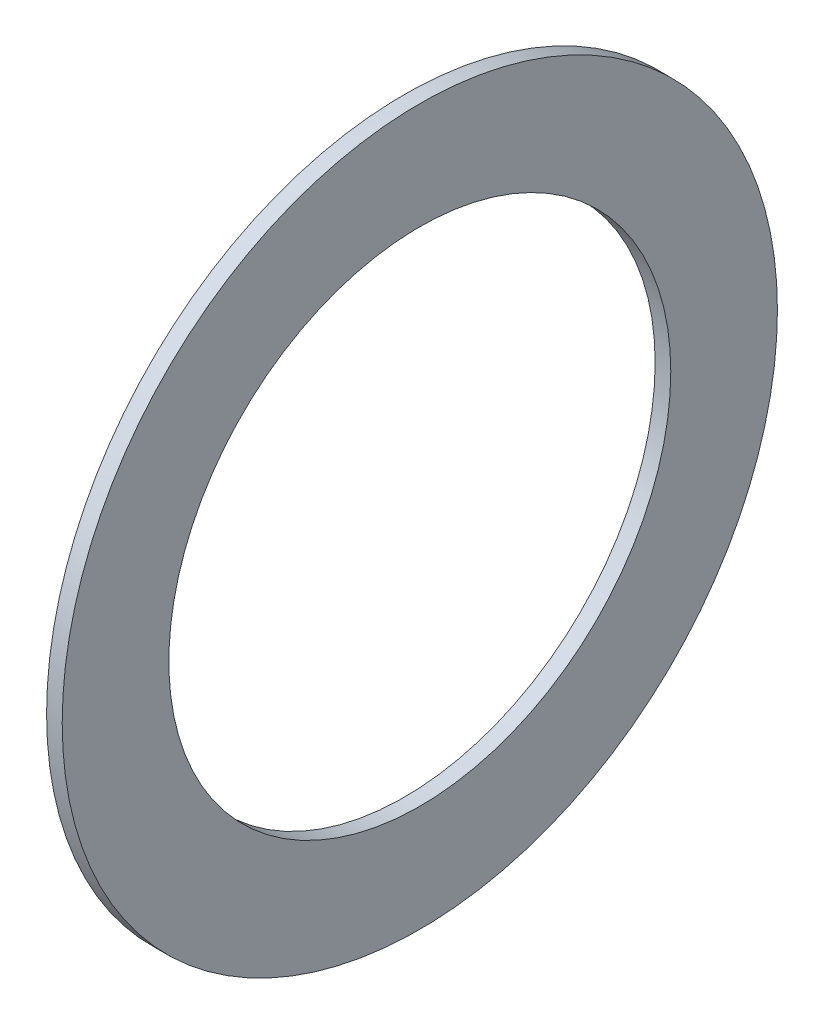
ISO-10303-21;
HEADER;
FILE_DESCRIPTION(('STEP AP214'),'2;1');
FILE_NAME('part.step','',(''),(''),'','','');
FILE_SCHEMA(('AUTOMOTIVE_DESIGN { 1 0 10303 214 1 1 1 1 }'));
ENDSEC;
DATA;
#1=APPLICATION_CONTEXT('core data for automotive mechanical design processes');
#2=APPLICATION_PROTOCOL_DEFINITION('international standard','automotive_design',2000,#1);
#3=PRODUCT_CONTEXT('',#1,'mechanical');
#4=PRODUCT('Part','Part','',(#3));
#5=PRODUCT_RELATED_PRODUCT_CATEGORY('part','',(#4));
#6=PRODUCT_DEFINITION_FORMATION('','',#4);
#7=PRODUCT_DEFINITION_CONTEXT('part definition',#1,'design');
#8=PRODUCT_DEFINITION('design','',#6,#7);
#9=PRODUCT_DEFINITION_SHAPE('','',#8);
#10=(LENGTH_UNIT() NAMED_UNIT(*) SI_UNIT(.MILLI.,.METRE.));
#11=(NAMED_UNIT(*) PLANE_ANGLE_UNIT() SI_UNIT($,.RADIAN.));
#12=(NAMED_UNIT(*) SI_UNIT($,.STERADIAN.) SOLID_ANGLE_UNIT());
#13=UNCERTAINTY_MEASURE_WITH_UNIT(LENGTH_MEASURE(1.E-05),#10,'distance_accuracy_value','');
#14=(GEOMETRIC_REPRESENTATION_CONTEXT(3) GLOBAL_UNCERTAINTY_ASSIGNED_CONTEXT((#13)) GLOBAL_UNIT_ASSIGNED_CONTEXT((#10,
#11,#12)) REPRESENTATION_CONTEXT('',''));
#15=CARTESIAN_POINT('',(0.,0.,0.));
#16=DIRECTION('',(0.,0.,1.));
#17=DIRECTION('',(1.,0.,0.));
#18=AXIS2_PLACEMENT_3D('',#15,#16,#17);
#19=CARTESIAN_POINT('',(-7.3144315497404,23.2577805330017,0.));
#20=DIRECTION('',(-1.,0.,0.));
#21=DIRECTION('',(0.,0.,1.));
#22=AXIS2_PLACEMENT_3D('',#19,#20,#21);
#23=PLANE('',#22);
#24=CARTESIAN_POINT('',(-7.31443154974033,0.,0.));
#25=DIRECTION('',(1.,0.,0.));
#26=DIRECTION('',(0.,0.,-1.));
#27=AXIS2_PLACEMENT_3D('',#24,#25,#26);
#28=CIRCLE('',#27,16.3222252770479);
#29=CARTESIAN_POINT('',(-7.31443154974033,0.,-16.3222252770479));
#30=VERTEX_POINT('',#29);
#31=EDGE_CURVE('E27',#30,#30,#28,.T.);
#32=ORIENTED_EDGE('',*,*,#31,.T.);
#33=EDGE_LOOP('',(#32));
#34=FACE_BOUND('',#33,.T.);
#35=CARTESIAN_POINT('',(-7.3144315497403,0.,0.));
#36=DIRECTION('',(1.,0.,0.));
#37=DIRECTION('',(0.,0.,-1.));
#38=AXIS2_PLACEMENT_3D('',#35,#36,#37);
#39=CIRCLE('',#38,23.2577805330017);
#40=CARTESIAN_POINT('',(-7.3144315497403,0.,-23.2577805330017));
#41=VERTEX_POINT('',#40);
#42=EDGE_CURVE('E18',#41,#41,#39,.T.);
#43=ORIENTED_EDGE('',*,*,#42,.F.);
#44=EDGE_LOOP('',(#43));
#45=FACE_BOUND('',#44,.T.);
#46=ADVANCED_FACE('F15',(#34,#45),#23,.T.);
#47=CARTESIAN_POINT('',(111.552923356394,0.,0.));
#48=DIRECTION('',(1.,0.,0.));
#49=DIRECTION('',(0.,0.,-1.));
#50=AXIS2_PLACEMENT_3D('',#47,#48,#49);
#51=CYLINDRICAL_SURFACE('',#50,23.2577805330017);
#52=CARTESIAN_POINT('',(-6.29843154974025,0.,0.));
#53=DIRECTION('',(1.,0.,0.));
#54=DIRECTION('',(0.,0.,-1.));
#55=AXIS2_PLACEMENT_3D('',#52,#53,#54);
#56=CIRCLE('',#55,23.2577805330017);
#57=CARTESIAN_POINT('',(-6.29843154974025,0.,-23.2577805330017));
#58=VERTEX_POINT('',#57);
#59=EDGE_CURVE('E22',#58,#58,#56,.T.);
#60=ORIENTED_EDGE('',*,*,#59,.F.);
#61=EDGE_LOOP('',(#60));
#62=FACE_BOUND('',#61,.T.);
#63=ORIENTED_EDGE('',*,*,#42,.T.);
#64=EDGE_LOOP('',(#63));
#65=FACE_BOUND('',#64,.T.);
#66=ADVANCED_FACE('F35',(#62,#65),#51,.T.);
#67=CARTESIAN_POINT('',(111.552923356394,0.,0.));
#68=DIRECTION('',(1.,0.,0.));
#69=DIRECTION('',(0.,0.,-1.));
#70=AXIS2_PLACEMENT_3D('',#67,#68,#69);
#71=CYLINDRICAL_SURFACE('',#70,16.3222252770479);
#72=ORIENTED_EDGE('',*,*,#31,.F.);
#73=EDGE_LOOP('',(#72));
#74=FACE_BOUND('',#73,.T.);
#75=CARTESIAN_POINT('',(-6.29843154974026,0.,0.));
#76=DIRECTION('',(1.,0.,0.));
#77=DIRECTION('',(0.,0.,-1.));
#78=AXIS2_PLACEMENT_3D('',#75,#76,#77);
#79=CIRCLE('',#78,16.3222252770479);
#80=CARTESIAN_POINT('',(-6.29843154974026,0.,-16.3222252770479));
#81=VERTEX_POINT('',#80);
#82=EDGE_CURVE('E10',#81,#81,#79,.F.);
#83=ORIENTED_EDGE('',*,*,#82,.F.);
#84=EDGE_LOOP('',(#83));
#85=FACE_BOUND('',#84,.T.);
#86=ADVANCED_FACE('F42',(#74,#85),#71,.F.);
#87=CARTESIAN_POINT('',(-6.2984315497404,23.2577805330017,0.));
#88=DIRECTION('',(1.,0.,0.));
#89=DIRECTION('',(0.,0.,-1.));
#90=AXIS2_PLACEMENT_3D('',#87,#88,#89);
#91=PLANE('',#90);
#92=ORIENTED_EDGE('',*,*,#82,.T.);
#93=EDGE_LOOP('',(#92));
#94=FACE_BOUND('',#93,.T.);
#95=ORIENTED_EDGE('',*,*,#59,.T.);
#96=EDGE_LOOP('',(#95));
#97=FACE_BOUND('',#96,.T.);
#98=ADVANCED_FACE('F44',(#94,#97),#91,.T.);
#99=CLOSED_SHELL('',(#46,#66,#86,#98));
#100=MANIFOLD_SOLID_BREP('B1',#99);
#101=ADVANCED_BREP_SHAPE_REPRESENTATION('',(#18,#100),#14);
#102=SHAPE_DEFINITION_REPRESENTATION(#9,#101);
ENDSEC;
END-ISO-10303-21;
